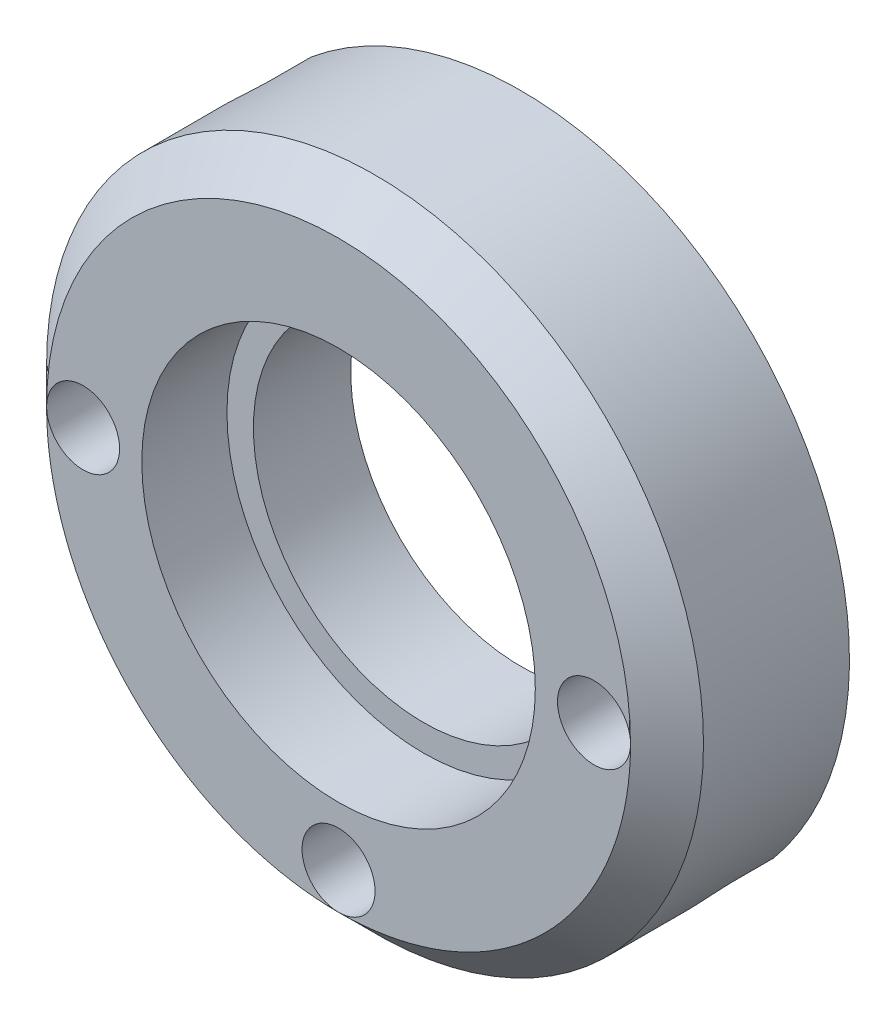
ISO-10303-21;
HEADER;
FILE_DESCRIPTION(('STEP AP214'),'2;1');
FILE_NAME('part.step','',(''),(''),'','','');
FILE_SCHEMA(('AUTOMOTIVE_DESIGN { 1 0 10303 214 1 1 1 1 }'));
ENDSEC;
DATA;
#1=APPLICATION_CONTEXT('core data for automotive mechanical design processes');
#2=APPLICATION_PROTOCOL_DEFINITION('international standard','automotive_design',2000,#1);
#3=PRODUCT_CONTEXT('',#1,'mechanical');
#4=PRODUCT('Part','Part','',(#3));
#5=PRODUCT_RELATED_PRODUCT_CATEGORY('part','',(#4));
#6=PRODUCT_DEFINITION_FORMATION('','',#4);
#7=PRODUCT_DEFINITION_CONTEXT('part definition',#1,'design');
#8=PRODUCT_DEFINITION('design','',#6,#7);
#9=PRODUCT_DEFINITION_SHAPE('','',#8);
#10=(LENGTH_UNIT() NAMED_UNIT(*) SI_UNIT(.MILLI.,.METRE.));
#11=(NAMED_UNIT(*) PLANE_ANGLE_UNIT() SI_UNIT($,.RADIAN.));
#12=(NAMED_UNIT(*) SI_UNIT($,.STERADIAN.) SOLID_ANGLE_UNIT());
#13=UNCERTAINTY_MEASURE_WITH_UNIT(LENGTH_MEASURE(1.E-05),#10,'distance_accuracy_value','');
#14=(GEOMETRIC_REPRESENTATION_CONTEXT(3) GLOBAL_UNCERTAINTY_ASSIGNED_CONTEXT((#13)) GLOBAL_UNIT_ASSIGNED_CONTEXT((#10,
#11,#12)) REPRESENTATION_CONTEXT('',''));
#15=CARTESIAN_POINT('',(0.,0.,0.));
#16=DIRECTION('',(0.,0.,1.));
#17=DIRECTION('',(1.,0.,0.));
#18=AXIS2_PLACEMENT_3D('',#15,#16,#17);
#19=CARTESIAN_POINT('',(0.,0.,0.));
#20=DIRECTION('',(0.,0.,1.));
#21=DIRECTION('',(1.,0.,0.));
#22=AXIS2_PLACEMENT_3D('',#19,#20,#21);
#23=PLANE('',#22);
#24=CARTESIAN_POINT('',(-21.,0.,0.));
#25=DIRECTION('',(0.,0.,1.));
#26=DIRECTION('',(1.,0.,0.));
#27=AXIS2_PLACEMENT_3D('',#24,#25,#26);
#28=CIRCLE('',#27,1.65);
#29=CARTESIAN_POINT('',(-19.35,0.,0.));
#30=VERTEX_POINT('',#29);
#31=EDGE_CURVE('E219',#30,#30,#28,.T.);
#32=ORIENTED_EDGE('',*,*,#31,.T.);
#33=EDGE_LOOP('',(#32));
#34=FACE_BOUND('',#33,.T.);
#35=CARTESIAN_POINT('',(0.,-21.,0.));
#36=DIRECTION('',(0.,0.,1.));
#37=DIRECTION('',(1.,0.,0.));
#38=AXIS2_PLACEMENT_3D('',#35,#36,#37);
#39=CIRCLE('',#38,1.65);
#40=CARTESIAN_POINT('',(1.65,-21.,0.));
#41=VERTEX_POINT('',#40);
#42=EDGE_CURVE('E223',#41,#41,#39,.T.);
#43=ORIENTED_EDGE('',*,*,#42,.T.);
#44=EDGE_LOOP('',(#43));
#45=FACE_BOUND('',#44,.T.);
#46=CARTESIAN_POINT('',(0.,0.,0.));
#47=DIRECTION('',(0.,0.,1.));
#48=DIRECTION('',(1.,0.,0.));
#49=AXIS2_PLACEMENT_3D('',#46,#47,#48);
#50=CIRCLE('',#49,27.);
#51=CARTESIAN_POINT('',(-20.7776328125668,17.2420989066339,0.));
#52=VERTEX_POINT('',#51);
#53=CARTESIAN_POINT('',(17.2420989066341,-20.7776328125667,0.));
#54=VERTEX_POINT('',#53);
#55=EDGE_CURVE('E226',#52,#54,#50,.T.);
#56=ORIENTED_EDGE('',*,*,#55,.F.);
#57=DIRECTION('',(0.707106781186551,-0.707106781186544,0.));
#58=VECTOR('',#57,1.);
#59=CARTESIAN_POINT('',(-28.7677669529665,25.2322330470335,0.));
#60=LINE('',#59,#58);
#61=CARTESIAN_POINT('',(-11.5081468223555,7.97261291642265,0.));
#62=VERTEX_POINT('',#61);
#63=EDGE_CURVE('E134',#52,#62,#60,.T.);
#64=ORIENTED_EDGE('',*,*,#63,.T.);
#65=CARTESIAN_POINT('',(0.,0.,0.));
#66=DIRECTION('',(0.,0.,1.));
#67=DIRECTION('',(1.,0.,0.));
#68=AXIS2_PLACEMENT_3D('',#65,#66,#67);
#69=CIRCLE('',#68,14.);
#70=CARTESIAN_POINT('',(7.97261291642278,-11.5081468223554,0.));
#71=VERTEX_POINT('',#70);
#72=EDGE_CURVE('E273',#62,#71,#69,.T.);
#73=ORIENTED_EDGE('',*,*,#72,.T.);
#74=EDGE_CURVE('E138',#71,#54,#60,.T.);
#75=ORIENTED_EDGE('',*,*,#74,.T.);
#76=EDGE_LOOP('',(#56,#64,#73,#75));
#77=FACE_BOUND('',#76,.T.);
#78=ADVANCED_FACE('F35',(#34,#45,#77),#23,.F.);
#79=CARTESIAN_POINT('',(0.,-21.,0.));
#80=DIRECTION('',(0.,0.,1.));
#81=DIRECTION('',(1.,0.,0.));
#82=AXIS2_PLACEMENT_3D('',#79,#80,#81);
#83=CYLINDRICAL_SURFACE('',#82,1.65);
#84=CARTESIAN_POINT('',(0.,-21.,8.49999999999999));
#85=DIRECTION('',(0.,0.,1.));
#86=DIRECTION('',(1.,0.,0.));
#87=AXIS2_PLACEMENT_3D('',#84,#85,#86);
#88=CIRCLE('',#87,1.65);
#89=CARTESIAN_POINT('',(1.65,-21.,8.49999999999999));
#90=VERTEX_POINT('',#89);
#91=EDGE_CURVE('E230',#90,#90,#88,.T.);
#92=ORIENTED_EDGE('',*,*,#91,.T.);
#93=EDGE_LOOP('',(#92));
#94=FACE_BOUND('',#93,.T.);
#95=ORIENTED_EDGE('',*,*,#42,.F.);
#96=EDGE_LOOP('',(#95));
#97=FACE_BOUND('',#96,.T.);
#98=ADVANCED_FACE('F209',(#94,#97),#83,.F.);
#99=CARTESIAN_POINT('',(21.,0.,0.));
#100=DIRECTION('',(0.,0.,1.));
#101=DIRECTION('',(1.,0.,0.));
#102=AXIS2_PLACEMENT_3D('',#99,#100,#101);
#103=CYLINDRICAL_SURFACE('',#102,1.65);
#104=CARTESIAN_POINT('',(21.,0.,8.49999999999999));
#105=DIRECTION('',(0.,0.,1.));
#106=DIRECTION('',(1.,0.,0.));
#107=AXIS2_PLACEMENT_3D('',#104,#105,#106);
#108=CIRCLE('',#107,1.65);
#109=CARTESIAN_POINT('',(22.65,0.,8.49999999999999));
#110=VERTEX_POINT('',#109);
#111=EDGE_CURVE('E233',#110,#110,#108,.T.);
#112=ORIENTED_EDGE('',*,*,#111,.T.);
#113=EDGE_LOOP('',(#112));
#114=FACE_BOUND('',#113,.T.);
#115=CARTESIAN_POINT('',(21.,0.,0.));
#116=DIRECTION('',(0.,0.,1.));
#117=DIRECTION('',(1.,0.,0.));
#118=AXIS2_PLACEMENT_3D('',#115,#116,#117);
#119=CIRCLE('',#118,1.65);
#120=CARTESIAN_POINT('',(22.65,0.,0.));
#121=VERTEX_POINT('',#120);
#122=EDGE_CURVE('E287',#121,#121,#119,.T.);
#123=ORIENTED_EDGE('',*,*,#122,.F.);
#124=EDGE_LOOP('',(#123));
#125=FACE_BOUND('',#124,.T.);
#126=ADVANCED_FACE('F214',(#114,#125),#103,.F.);
#127=CARTESIAN_POINT('',(-21.,0.,0.));
#128=DIRECTION('',(0.,0.,1.));
#129=DIRECTION('',(1.,0.,0.));
#130=AXIS2_PLACEMENT_3D('',#127,#128,#129);
#131=CYLINDRICAL_SURFACE('',#130,1.65);
#132=CARTESIAN_POINT('',(-21.,0.,8.49999999999999));
#133=DIRECTION('',(0.,0.,1.));
#134=DIRECTION('',(1.,0.,0.));
#135=AXIS2_PLACEMENT_3D('',#132,#133,#134);
#136=CIRCLE('',#135,1.65);
#137=CARTESIAN_POINT('',(-19.35,0.,8.49999999999999));
#138=VERTEX_POINT('',#137);
#139=EDGE_CURVE('E242',#138,#138,#136,.T.);
#140=ORIENTED_EDGE('',*,*,#139,.T.);
#141=EDGE_LOOP('',(#140));
#142=FACE_BOUND('',#141,.T.);
#143=ORIENTED_EDGE('',*,*,#31,.F.);
#144=EDGE_LOOP('',(#143));
#145=FACE_BOUND('',#144,.T.);
#146=ADVANCED_FACE('F188',(#142,#145),#131,.F.);
#147=CARTESIAN_POINT('',(0.,0.,15.));
#148=DIRECTION('',(0.,0.,-1.));
#149=DIRECTION('',(-1.,0.,0.));
#150=AXIS2_PLACEMENT_3D('',#147,#148,#149);
#151=CYLINDRICAL_SURFACE('',#150,27.);
#152=CARTESIAN_POINT('',(0.,0.,12.));
#153=DIRECTION('',(0.,0.,1.));
#154=DIRECTION('',(1.,0.,0.));
#155=AXIS2_PLACEMENT_3D('',#152,#153,#154);
#156=CIRCLE('',#155,27.);
#157=CARTESIAN_POINT('',(27.,0.,12.));
#158=VERTEX_POINT('',#157);
#159=EDGE_CURVE('E261',#158,#158,#156,.F.);
#160=ORIENTED_EDGE('',*,*,#159,.T.);
#161=EDGE_LOOP('',(#160));
#162=FACE_BOUND('',#161,.T.);
#163=ORIENTED_EDGE('',*,*,#55,.T.);
#164=DIRECTION('',(0.,0.,-1.));
#165=VECTOR('',#164,1.);
#166=CARTESIAN_POINT('',(17.2420989066341,-20.7776328125667,15.));
#167=LINE('',#166,#165);
#168=CARTESIAN_POINT('',(17.2420989066341,-20.7776328125667,3.));
#169=VERTEX_POINT('',#168);
#170=EDGE_CURVE('E300',#54,#169,#167,.F.);
#171=ORIENTED_EDGE('',*,*,#170,.T.);
#172=CARTESIAN_POINT('',(17.2420989066341,-20.7776328125667,3.));
#173=CARTESIAN_POINT('',(17.242092113643,-20.7776357941308,3.0701545444243));
#174=CARTESIAN_POINT('',(17.2443810988734,-20.7757388904638,3.14030568935821));
#175=CARTESIAN_POINT('',(17.2534987049175,-20.7681690750989,3.28010312701162));
#176=CARTESIAN_POINT('',(17.2603270361537,-20.7624964042678,3.34974945164855));
#177=CARTESIAN_POINT('',(17.2784634540722,-20.7474054443848,3.48798751070465));
#178=CARTESIAN_POINT('',(17.2897675991885,-20.7379904509313,3.55658011800341));
#179=CARTESIAN_POINT('',(17.3167413230267,-20.7154718920194,3.69226511941136));
#180=CARTESIAN_POINT('',(17.3324108634659,-20.7023683589078,3.7593575266711));
#181=CARTESIAN_POINT('',(17.3857951826166,-20.6575971029751,3.95772640740065));
#182=CARTESIAN_POINT('',(17.4298948560318,-20.6204611606387,4.08616386022387));
#183=CARTESIAN_POINT('',(17.5335007138444,-20.5324363100476,4.33148646651481));
#184=CARTESIAN_POINT('',(17.5930048754751,-20.4815492074222,4.44837313393634));
#185=CARTESIAN_POINT('',(17.7255787132559,-20.3669226517751,4.66774110207968));
#186=CARTESIAN_POINT('',(17.7986845214974,-20.3031489263157,4.77018272547308));
#187=CARTESIAN_POINT('',(17.9559146480707,-20.1642285303134,4.95739831461068));
#188=CARTESIAN_POINT('',(18.0400406409458,-20.0890801310913,5.04216959022038));
#189=CARTESIAN_POINT('',(18.2167228610474,-19.9290045348194,5.19176848261166));
#190=CARTESIAN_POINT('',(18.3092937377399,-19.8440602746613,5.25656055467175));
#191=CARTESIAN_POINT('',(18.4997897738783,-19.6665885563002,5.36412904893103));
#192=CARTESIAN_POINT('',(18.5977144956655,-19.5740617176397,5.40690726772035));
#193=CARTESIAN_POINT('',(18.7956197912796,-19.3841023961368,5.46912123617305));
#194=CARTESIAN_POINT('',(18.8955936592095,-19.2866847525624,5.48862361758948));
#195=CARTESIAN_POINT('',(19.0949101405056,-19.0893705559749,5.50393835168246));
#196=CARTESIAN_POINT('',(19.1942527526262,-18.9894739980719,5.49975065762391));
#197=CARTESIAN_POINT('',(19.3891882675343,-18.7903894106921,5.46785758905663));
#198=CARTESIAN_POINT('',(19.4847917582348,-18.6912001471678,5.4402245477839));
#199=CARTESIAN_POINT('',(19.6700167345719,-18.4961763654849,5.36233786219506));
#200=CARTESIAN_POINT('',(19.7596381813718,-18.4003418691081,5.31208407103638));
#201=CARTESIAN_POINT('',(19.9307723033986,-18.2148368911332,5.19030140427799));
#202=CARTESIAN_POINT('',(20.0122722891732,-18.1251761212316,5.11873991093602));
#203=CARTESIAN_POINT('',(20.1650660247655,-17.9550329416453,4.95640008053041));
#204=CARTESIAN_POINT('',(20.2363599796053,-17.8745503475929,4.86562212958407));
#205=CARTESIAN_POINT('',(20.3673772569364,-17.7251199137954,4.66703368732774));
#206=CARTESIAN_POINT('',(20.4270577343511,-17.6562149097238,4.55916269377615));
#207=CARTESIAN_POINT('',(20.5332453708419,-17.5326124300177,4.32961451167054));
#208=CARTESIAN_POINT('',(20.5797484986951,-17.4779193025134,4.20793311413888));
#209=CARTESIAN_POINT('',(20.6586051909831,-17.3846420633818,3.95415757677761));
#210=CARTESIAN_POINT('',(20.6909479386728,-17.3460702674363,3.82205556749943));
#211=CARTESIAN_POINT('',(20.7407245959599,-17.2865229202207,3.55135630411403));
#212=CARTESIAN_POINT('',(20.7581810870229,-17.2655207179635,3.41276922554558));
#213=CARTESIAN_POINT('',(20.7712383165892,-17.2498019618966,3.2276824918942));
#214=CARTESIAN_POINT('',(20.7736377284412,-17.2469121418256,3.18218674112657));
#215=CARTESIAN_POINT('',(20.7768327899953,-17.2430632091453,3.0911336242028));
#216=CARTESIAN_POINT('',(20.7776311120313,-17.2421008794195,3.0455764879269));
#217=CARTESIAN_POINT('',(20.7776328125668,-17.2420989066339,3.));
#218=B_SPLINE_CURVE_WITH_KNOTS('',3,(#172,#173,#174,#175,#176,#177,#178,#179,#180,#181,#182,
#183,#184,#185,#186,#187,#188,#189,#190,#191,#192,#193,#194,#195,#196,#197,#198,#199,#200,#201,
#202,#203,#204,#205,#206,#207,#208,#209,#210,#211,#212,#213,#214,#215,#216,#217),.UNSPECIFIED.,
.F.,.F.,(4,2,2,2,2,2,2,2,2,2,2,2,2,2,2,2,2,2,2,2,2,2,4),(0.,0.210394586808946,0.420775753245328,
0.630972060898041,0.841166525275143,1.26134710452853,1.68147253774226,2.10273037426022,
2.52405229632554,2.94611951832915,3.36815228920328,3.78897398633507,4.20979651365212,
4.62932542689363,5.04885706354595,5.46903424843744,5.88920299148783,6.31089361871854,
6.73271311088122,7.15485426015842,7.57635390435052,7.71325623090148,7.84992986683264),.UNSPECIFIED.);
#219=CARTESIAN_POINT('',(20.7776328125668,-17.2420989066339,3.));
#220=VERTEX_POINT('',#219);
#221=EDGE_CURVE('E120',#169,#220,#218,.T.);
#222=ORIENTED_EDGE('',*,*,#221,.T.);
#223=DIRECTION('',(0.,0.,-1.));
#224=VECTOR('',#223,1.);
#225=CARTESIAN_POINT('',(20.7776328125668,-17.2420989066339,15.));
#226=LINE('',#225,#224);
#227=CARTESIAN_POINT('',(20.7776328125668,-17.2420989066339,0.));
#228=VERTEX_POINT('',#227);
#229=EDGE_CURVE('E121',#220,#228,#226,.T.);
#230=ORIENTED_EDGE('',*,*,#229,.T.);
#231=CARTESIAN_POINT('',(-17.2420989066341,20.7776328125667,0.));
#232=VERTEX_POINT('',#231);
#233=EDGE_CURVE('E133',#228,#232,#50,.T.);
#234=ORIENTED_EDGE('',*,*,#233,.T.);
#235=DIRECTION('',(0.,0.,-1.));
#236=VECTOR('',#235,1.);
#237=CARTESIAN_POINT('',(-17.2420989066341,20.7776328125667,15.));
#238=LINE('',#237,#236);
#239=CARTESIAN_POINT('',(-17.2420989066341,20.7776328125667,3.));
#240=VERTEX_POINT('',#239);
#241=EDGE_CURVE('E124',#232,#240,#238,.F.);
#242=ORIENTED_EDGE('',*,*,#241,.T.);
#243=CARTESIAN_POINT('',(-17.2420989066341,20.7776328125667,3.));
#244=CARTESIAN_POINT('',(-17.242092113643,20.7776357941308,3.0701545444243));
#245=CARTESIAN_POINT('',(-17.2443810988734,20.7757388904638,3.1403056893582));
#246=CARTESIAN_POINT('',(-17.2534987049175,20.7681690750989,3.28010312701162));
#247=CARTESIAN_POINT('',(-17.2603270361537,20.7624964042678,3.34974945164855));
#248=CARTESIAN_POINT('',(-17.2784634540722,20.7474054443848,3.48798751070464));
#249=CARTESIAN_POINT('',(-17.2897675991885,20.7379904509313,3.55658011800341));
#250=CARTESIAN_POINT('',(-17.3167413230267,20.7154718920194,3.69226511941136));
#251=CARTESIAN_POINT('',(-17.3324108634659,20.7023683589078,3.75935752667109));
#252=CARTESIAN_POINT('',(-17.3857951826166,20.6575971029751,3.95772640740065));
#253=CARTESIAN_POINT('',(-17.4298948560318,20.6204611606387,4.08616386022386));
#254=CARTESIAN_POINT('',(-17.5335007138444,20.5324363100476,4.33148646651481));
#255=CARTESIAN_POINT('',(-17.5930048754751,20.4815492074222,4.44837313393633));
#256=CARTESIAN_POINT('',(-17.7255787132559,20.3669226517751,4.66774110207967));
#257=CARTESIAN_POINT('',(-17.7986845214974,20.3031489263157,4.77018272547307));
#258=CARTESIAN_POINT('',(-17.9559146480707,20.1642285303134,4.95739831461068));
#259=CARTESIAN_POINT('',(-18.0400406409458,20.0890801310913,5.04216959022037));
#260=CARTESIAN_POINT('',(-18.2167228610474,19.9290045348194,5.19176848261166));
#261=CARTESIAN_POINT('',(-18.3092937377399,19.8440602746613,5.25656055467174));
#262=CARTESIAN_POINT('',(-18.4997897738783,19.6665885563002,5.36412904893103));
#263=CARTESIAN_POINT('',(-18.5977144956655,19.5740617176397,5.40690726772035));
#264=CARTESIAN_POINT('',(-18.7956197912796,19.3841023961368,5.46912123617304));
#265=CARTESIAN_POINT('',(-18.8955936592095,19.2866847525624,5.48862361758947));
#266=CARTESIAN_POINT('',(-19.0949101405056,19.0893705559749,5.50393835168245));
#267=CARTESIAN_POINT('',(-19.1942527526262,18.9894739980719,5.4997506576239));
#268=CARTESIAN_POINT('',(-19.3891882675343,18.7903894106921,5.46785758905662));
#269=CARTESIAN_POINT('',(-19.4847917582348,18.6912001471678,5.44022454778389));
#270=CARTESIAN_POINT('',(-19.6700167345719,18.4961763654849,5.36233786219506));
#271=CARTESIAN_POINT('',(-19.7596381813718,18.4003418691081,5.31208407103637));
#272=CARTESIAN_POINT('',(-19.9307723033986,18.2148368911332,5.19030140427799));
#273=CARTESIAN_POINT('',(-20.0122722891732,18.1251761212316,5.11873991093601));
#274=CARTESIAN_POINT('',(-20.1650660247655,17.9550329416453,4.9564000805304));
#275=CARTESIAN_POINT('',(-20.2363599796053,17.8745503475929,4.86562212958407));
#276=CARTESIAN_POINT('',(-20.3673772569364,17.7251199137954,4.66703368732774));
#277=CARTESIAN_POINT('',(-20.4270577343511,17.6562149097238,4.55916269377615));
#278=CARTESIAN_POINT('',(-20.5332453708419,17.5326124300178,4.32961451167053));
#279=CARTESIAN_POINT('',(-20.5797484986951,17.4779193025134,4.20793311413887));
#280=CARTESIAN_POINT('',(-20.6586051909831,17.3846420633818,3.9541575767776));
#281=CARTESIAN_POINT('',(-20.6909479386728,17.3460702674363,3.82205556749942));
#282=CARTESIAN_POINT('',(-20.7407245959599,17.2865229202207,3.55135630411402));
#283=CARTESIAN_POINT('',(-20.7581810870229,17.2655207179635,3.41276922554557));
#284=CARTESIAN_POINT('',(-20.7712383165892,17.2498019618966,3.2276824918942));
#285=CARTESIAN_POINT('',(-20.7736377284412,17.2469121418256,3.18218674112657));
#286=CARTESIAN_POINT('',(-20.7768327899953,17.2430632091452,3.0911336242028));
#287=CARTESIAN_POINT('',(-20.7776311120313,17.2421008794195,3.0455764879269));
#288=CARTESIAN_POINT('',(-20.7776328125668,17.2420989066339,3.));
#289=B_SPLINE_CURVE_WITH_KNOTS('',3,(#243,#244,#245,#246,#247,#248,#249,#250,#251,#252,#253,
#254,#255,#256,#257,#258,#259,#260,#261,#262,#263,#264,#265,#266,#267,#268,#269,#270,#271,#272,
#273,#274,#275,#276,#277,#278,#279,#280,#281,#282,#283,#284,#285,#286,#287,#288),.UNSPECIFIED.,
.F.,.F.,(4,2,2,2,2,2,2,2,2,2,2,2,2,2,2,2,2,2,2,2,2,2,4),(0.,0.210394586808946,0.420775753245328,
0.630972060898041,0.841166525275141,1.26134710452853,1.68147253774225,2.10273037426022,
2.52405229632554,2.94611951832915,3.36815228920328,3.78897398633507,4.20979651365212,
4.62932542689363,5.04885706354595,5.46903424843744,5.88920299148782,6.31089361871853,
6.73271311088122,7.15485426015842,7.57635390435052,7.71325623090148,7.84992986683264),.UNSPECIFIED.);
#290=CARTESIAN_POINT('',(-20.7776328125668,17.2420989066339,3.));
#291=VERTEX_POINT('',#290);
#292=EDGE_CURVE('E110',#240,#291,#289,.T.);
#293=ORIENTED_EDGE('',*,*,#292,.T.);
#294=DIRECTION('',(0.,0.,-1.));
#295=VECTOR('',#294,1.);
#296=CARTESIAN_POINT('',(-20.7776328125668,17.2420989066339,15.));
#297=LINE('',#296,#295);
#298=EDGE_CURVE('E297',#291,#52,#297,.T.);
#299=ORIENTED_EDGE('',*,*,#298,.T.);
#300=EDGE_LOOP('',(#163,#171,#222,#230,#234,#242,#293,#299));
#301=FACE_BOUND('',#300,.T.);
#302=ADVANCED_FACE('F130',(#162,#301),#151,.T.);
#303=CARTESIAN_POINT('',(0.,0.,15.));
#304=DIRECTION('',(0.,0.,1.));
#305=DIRECTION('',(1.,0.,0.));
#306=AXIS2_PLACEMENT_3D('',#303,#304,#305);
#307=PLANE('',#306);
#308=CARTESIAN_POINT('',(21.,0.,15.));
#309=DIRECTION('',(0.,0.,1.));
#310=DIRECTION('',(1.,0.,0.));
#311=AXIS2_PLACEMENT_3D('',#308,#309,#310);
#312=CIRCLE('',#311,3.);
#313=CARTESIAN_POINT('',(24.,0.,15.));
#314=VERTEX_POINT('',#313);
#315=EDGE_CURVE('E293',#314,#314,#312,.T.);
#316=ORIENTED_EDGE('',*,*,#315,.F.);
#317=CARTESIAN_POINT('',(0.,0.,15.));
#318=DIRECTION('',(0.,0.,1.));
#319=DIRECTION('',(1.,0.,0.));
#320=AXIS2_PLACEMENT_3D('',#317,#318,#319);
#321=CIRCLE('',#320,24.);
#322=CARTESIAN_POINT('',(-24.,0.,15.));
#323=VERTEX_POINT('',#322);
#324=EDGE_CURVE('E258',#314,#323,#321,.T.);
#325=ORIENTED_EDGE('',*,*,#324,.T.);
#326=CARTESIAN_POINT('',(-21.,0.,15.));
#327=DIRECTION('',(0.,0.,1.));
#328=DIRECTION('',(1.,0.,0.));
#329=AXIS2_PLACEMENT_3D('',#326,#327,#328);
#330=CIRCLE('',#329,3.);
#331=EDGE_CURVE('E289',#323,#323,#330,.T.);
#332=ORIENTED_EDGE('',*,*,#331,.F.);
#333=CARTESIAN_POINT('',(0.,0.,15.));
#334=DIRECTION('',(0.,0.,1.));
#335=DIRECTION('',(1.,0.,0.));
#336=AXIS2_PLACEMENT_3D('',#333,#334,#335);
#337=CIRCLE('',#336,24.);
#338=CARTESIAN_POINT('',(0.,-24.,15.));
#339=VERTEX_POINT('',#338);
#340=EDGE_CURVE('E256',#323,#339,#337,.T.);
#341=ORIENTED_EDGE('',*,*,#340,.T.);
#342=CARTESIAN_POINT('',(0.,-21.,15.));
#343=DIRECTION('',(0.,0.,1.));
#344=DIRECTION('',(1.,0.,0.));
#345=AXIS2_PLACEMENT_3D('',#342,#343,#344);
#346=CIRCLE('',#345,3.);
#347=EDGE_CURVE('E294',#339,#339,#346,.T.);
#348=ORIENTED_EDGE('',*,*,#347,.F.);
#349=CARTESIAN_POINT('',(0.,0.,15.));
#350=DIRECTION('',(0.,0.,1.));
#351=DIRECTION('',(1.,0.,0.));
#352=AXIS2_PLACEMENT_3D('',#349,#350,#351);
#353=CIRCLE('',#352,24.);
#354=EDGE_CURVE('E254',#339,#314,#353,.T.);
#355=ORIENTED_EDGE('',*,*,#354,.T.);
#356=EDGE_LOOP('',(#316,#325,#332,#341,#348,#355));
#357=FACE_BOUND('',#356,.T.);
#358=CARTESIAN_POINT('',(0.,0.,15.));
#359=DIRECTION('',(0.,0.,1.));
#360=DIRECTION('',(1.,0.,0.));
#361=AXIS2_PLACEMENT_3D('',#358,#359,#360);
#362=CIRCLE('',#361,16.175);
#363=CARTESIAN_POINT('',(16.175,0.,15.));
#364=VERTEX_POINT('',#363);
#365=EDGE_CURVE('E237',#364,#364,#362,.T.);
#366=ORIENTED_EDGE('',*,*,#365,.F.);
#367=EDGE_LOOP('',(#366));
#368=FACE_BOUND('',#367,.T.);
#369=ADVANCED_FACE('F199',(#357,#368),#307,.T.);
#370=ORIENTED_EDGE('',*,*,#122,.T.);
#371=EDGE_LOOP('',(#370));
#372=FACE_BOUND('',#371,.T.);
#373=ORIENTED_EDGE('',*,*,#233,.F.);
#374=DIRECTION('',(0.707106781186551,-0.707106781186544,0.));
#375=VECTOR('',#374,1.);
#376=CARTESIAN_POINT('',(-25.2322330470338,28.7677669529662,0.));
#377=LINE('',#376,#375);
#378=CARTESIAN_POINT('',(11.5081468223555,-7.97261291642266,0.));
#379=VERTEX_POINT('',#378);
#380=EDGE_CURVE('E141',#379,#228,#377,.T.);
#381=ORIENTED_EDGE('',*,*,#380,.F.);
#382=CARTESIAN_POINT('',(-7.97261291642277,11.5081468223554,0.));
#383=VERTEX_POINT('',#382);
#384=EDGE_CURVE('E271',#379,#383,#69,.T.);
#385=ORIENTED_EDGE('',*,*,#384,.T.);
#386=EDGE_CURVE('E58',#232,#383,#377,.T.);
#387=ORIENTED_EDGE('',*,*,#386,.F.);
#388=EDGE_LOOP('',(#373,#381,#385,#387));
#389=FACE_BOUND('',#388,.T.);
#390=ADVANCED_FACE('F197',(#372,#389),#23,.F.);
#391=CARTESIAN_POINT('',(0.,0.,8.));
#392=DIRECTION('',(0.,0.,1.));
#393=DIRECTION('',(1.,0.,0.));
#394=AXIS2_PLACEMENT_3D('',#391,#392,#393);
#395=CYLINDRICAL_SURFACE('',#394,16.175);
#396=CARTESIAN_POINT('',(0.,0.,8.));
#397=DIRECTION('',(0.,0.,1.));
#398=DIRECTION('',(1.,0.,0.));
#399=AXIS2_PLACEMENT_3D('',#396,#397,#398);
#400=CIRCLE('',#399,16.175);
#401=CARTESIAN_POINT('',(16.175,0.,8.));
#402=VERTEX_POINT('',#401);
#403=EDGE_CURVE('E235',#402,#402,#400,.T.);
#404=ORIENTED_EDGE('',*,*,#403,.F.);
#405=EDGE_LOOP('',(#404));
#406=FACE_BOUND('',#405,.T.);
#407=ORIENTED_EDGE('',*,*,#365,.T.);
#408=EDGE_LOOP('',(#407));
#409=FACE_BOUND('',#408,.T.);
#410=ADVANCED_FACE('F193',(#406,#409),#395,.F.);
#411=CARTESIAN_POINT('',(0.,0.,8.));
#412=DIRECTION('',(0.,0.,1.));
#413=DIRECTION('',(1.,0.,0.));
#414=AXIS2_PLACEMENT_3D('',#411,#412,#413);
#415=PLANE('',#414);
#416=CARTESIAN_POINT('',(0.,0.,8.));
#417=DIRECTION('',(0.,0.,1.));
#418=DIRECTION('',(1.,0.,0.));
#419=AXIS2_PLACEMENT_3D('',#416,#417,#418);
#420=CIRCLE('',#419,14.);
#421=CARTESIAN_POINT('',(14.,0.,8.));
#422=VERTEX_POINT('',#421);
#423=EDGE_CURVE('E274',#422,#422,#420,.T.);
#424=ORIENTED_EDGE('',*,*,#423,.F.);
#425=EDGE_LOOP('',(#424));
#426=FACE_BOUND('',#425,.T.);
#427=ORIENTED_EDGE('',*,*,#403,.T.);
#428=EDGE_LOOP('',(#427));
#429=FACE_BOUND('',#428,.T.);
#430=ADVANCED_FACE('F186',(#426,#429),#415,.T.);
#431=CARTESIAN_POINT('',(0.,0.,0.));
#432=DIRECTION('',(0.,0.,1.));
#433=DIRECTION('',(1.,0.,0.));
#434=AXIS2_PLACEMENT_3D('',#431,#432,#433);
#435=CYLINDRICAL_SURFACE('',#434,14.);
#436=ORIENTED_EDGE('',*,*,#72,.F.);
#437=DIRECTION('',(0.,0.,1.));
#438=VECTOR('',#437,1.);
#439=CARTESIAN_POINT('',(-11.5081468223555,7.97261291642266,0.));
#440=LINE('',#439,#438);
#441=CARTESIAN_POINT('',(-11.5081468223555,7.97261291642265,3.));
#442=VERTEX_POINT('',#441);
#443=EDGE_CURVE('E11',#62,#442,#440,.T.);
#444=ORIENTED_EDGE('',*,*,#443,.T.);
#445=CARTESIAN_POINT('',(-11.5081468223555,7.97261291642266,3.));
#446=CARTESIAN_POINT('',(-11.5081482751869,7.97260392155317,3.06971697638907));
#447=CARTESIAN_POINT('',(-11.5064589260711,7.97504915039907,3.13942998362751));
#448=CARTESIAN_POINT('',(-11.499711218503,7.98477964839801,3.27834605861581));
#449=CARTESIAN_POINT('',(-11.494653223865,7.99206439488195,3.34754918061746));
#450=CARTESIAN_POINT('',(-11.4811899418938,8.01139244550216,3.48486566373059));
#451=CARTESIAN_POINT('',(-11.4727891991963,8.02342928874825,3.55298037434703));
#452=CARTESIAN_POINT('',(-11.452673263559,8.05211645225039,3.68771316255523));
#453=CARTESIAN_POINT('',(-11.4409580683183,8.0687667757091,3.75433123910799));
#454=CARTESIAN_POINT('',(-11.4008770170918,8.12540307029336,3.9512638683339));
#455=CARTESIAN_POINT('',(-11.3675661198317,8.17208844144952,4.0787551465722));
#456=CARTESIAN_POINT('',(-11.2882171430319,8.28134538688756,4.32237599287896));
#457=CARTESIAN_POINT('',(-11.2421785086967,8.34391765366125,4.43850506537596));
#458=CARTESIAN_POINT('',(-11.1374273498375,8.48324021657734,4.65748626733189));
#459=CARTESIAN_POINT('',(-11.078592635109,8.56012609646048,4.7601939412292));
#460=CARTESIAN_POINT('',(-10.9493752177633,8.72479890385242,4.94814426496264));
#461=CARTESIAN_POINT('',(-10.8789907424044,8.81258750428666,5.03338422920341));
#462=CARTESIAN_POINT('',(-10.7273390429224,8.99658186345854,5.18452843563948));
#463=CARTESIAN_POINT('',(-10.6460003950004,9.09284129108374,5.25029585715184));
#464=CARTESIAN_POINT('',(-10.4744715191747,9.28991329397723,5.35974231123105));
#465=CARTESIAN_POINT('',(-10.3842824488026,9.39072527289652,5.40342422773836));
#466=CARTESIAN_POINT('',(-10.1981825022824,9.59248148539148,5.46701608599129));
#467=CARTESIAN_POINT('',(-10.102342021046,9.69341310554671,5.48717193496554));
#468=CARTESIAN_POINT('',(-9.90665109994172,9.89332205591302,5.50390501376051));
#469=CARTESIAN_POINT('',(-9.80680087694968,9.99229949138975,5.50048351711136));
#470=CARTESIAN_POINT('',(-9.60718017574208,10.1843538968597,5.47034819624431));
#471=CARTESIAN_POINT('',(-9.50742170472061,10.2774851689182,5.4438997074663));
#472=CARTESIAN_POINT('',(-9.30993391670704,10.4567167067106,5.36888017727771));
#473=CARTESIAN_POINT('',(-9.21220465495475,10.5428167812254,5.32030853444662));
#474=CARTESIAN_POINT('',(-9.02142927449996,10.7065266045712,5.20216299897989));
#475=CARTESIAN_POINT('',(-8.92841014194874,10.7840898900408,5.13248123964125));
#476=CARTESIAN_POINT('',(-8.75073647420142,10.9287582634635,4.97417505886994));
#477=CARTESIAN_POINT('',(-8.66608241673855,10.9958627542363,4.88554955646475));
#478=CARTESIAN_POINT('',(-8.50701852855722,11.1193945666923,4.69041868144176));
#479=CARTESIAN_POINT('',(-8.43276617568633,11.1756617780058,4.58368346163122));
#480=CARTESIAN_POINT('',(-8.29871657293149,11.275562799883,4.35609147898948));
#481=CARTESIAN_POINT('',(-8.2389233986081,11.3191930491921,4.23523074885368));
#482=CARTESIAN_POINT('',(-8.13613264951051,11.3933043807004,3.98252002485493));
#483=CARTESIAN_POINT('',(-8.09316876378484,11.4237591005803,3.85064862307629));
#484=CARTESIAN_POINT('',(-8.02611121959555,11.4709741961224,3.57995137588755));
#485=CARTESIAN_POINT('',(-8.00198939541684,11.4877550135984,3.44113624200724));
#486=CARTESIAN_POINT('',(-7.98273815022568,11.5011265272899,3.25103901048054));
#487=CARTESIAN_POINT('',(-7.97894047773278,11.503760966035,3.20089831384011));
#488=CARTESIAN_POINT('',(-7.97388099504829,11.5072687175228,3.10051246529162));
#489=CARTESIAN_POINT('',(-7.97261492305557,11.5081449900437,3.05026763171408));
#490=CARTESIAN_POINT('',(-7.97261291642277,11.5081468223554,3.));
#491=B_SPLINE_CURVE_WITH_KNOTS('',3,(#445,#446,#447,#448,#449,#450,#451,#452,#453,#454,#455,
#456,#457,#458,#459,#460,#461,#462,#463,#464,#465,#466,#467,#468,#469,#470,#471,#472,#473,#474,
#475,#476,#477,#478,#479,#480,#481,#482,#483,#484,#485,#486,#487,#488,#489,#490),.UNSPECIFIED.,
.F.,.F.,(4,2,2,2,2,2,2,2,2,2,2,2,2,2,2,2,2,2,2,2,2,2,4),(0.,0.209080632365448,0.41813868764087,
0.626913483707537,0.835688424705488,1.25294270731087,1.67021518068189,2.09166233739033,
2.51317424149734,2.93758113507458,3.36193259498486,3.78180761495385,4.2016599555548,
4.61673750871168,5.03182634647342,5.44907300587891,5.8663434806745,6.28937182366545,
6.71251926562592,7.13650949186788,7.55986470459477,7.71085292872879,7.86158675831533),.UNSPECIFIED.);
#492=CARTESIAN_POINT('',(-7.97261291642277,11.5081468223554,3.));
#493=VERTEX_POINT('',#492);
#494=EDGE_CURVE('E43',#442,#493,#491,.T.);
#495=ORIENTED_EDGE('',*,*,#494,.T.);
#496=DIRECTION('',(0.,0.,1.));
#497=VECTOR('',#496,1.);
#498=CARTESIAN_POINT('',(-7.97261291642277,11.5081468223554,0.));
#499=LINE('',#498,#497);
#500=EDGE_CURVE('E125',#493,#383,#499,.F.);
#501=ORIENTED_EDGE('',*,*,#500,.T.);
#502=ORIENTED_EDGE('',*,*,#384,.F.);
#503=DIRECTION('',(0.,0.,1.));
#504=VECTOR('',#503,1.);
#505=CARTESIAN_POINT('',(11.5081468223555,-7.97261291642265,0.));
#506=LINE('',#505,#504);
#507=CARTESIAN_POINT('',(11.5081468223555,-7.97261291642265,3.));
#508=VERTEX_POINT('',#507);
#509=EDGE_CURVE('E263',#379,#508,#506,.T.);
#510=ORIENTED_EDGE('',*,*,#509,.T.);
#511=CARTESIAN_POINT('',(11.5081468223555,-7.97261291642265,3.));
#512=CARTESIAN_POINT('',(11.5081482751869,-7.97260392155316,3.06971697638908));
#513=CARTESIAN_POINT('',(11.5064589260711,-7.97504915039906,3.13942998362751));
#514=CARTESIAN_POINT('',(11.499711218503,-7.98477964839801,3.27834605861581));
#515=CARTESIAN_POINT('',(11.494653223865,-7.99206439488194,3.34754918061746));
#516=CARTESIAN_POINT('',(11.4811899418938,-8.01139244550216,3.48486566373059));
#517=CARTESIAN_POINT('',(11.4727891991963,-8.02342928874826,3.55298037434703));
#518=CARTESIAN_POINT('',(11.452673263559,-8.0521164522504,3.68771316255523));
#519=CARTESIAN_POINT('',(11.4409580683183,-8.06876677570911,3.754331239108));
#520=CARTESIAN_POINT('',(11.4008770170918,-8.12540307029336,3.9512638683339));
#521=CARTESIAN_POINT('',(11.3675661198317,-8.17208844144952,4.07875514657221));
#522=CARTESIAN_POINT('',(11.2882171430319,-8.28134538688756,4.32237599287897));
#523=CARTESIAN_POINT('',(11.2421785086967,-8.34391765366125,4.43850506537597));
#524=CARTESIAN_POINT('',(11.1374273498375,-8.48324021657734,4.65748626733189));
#525=CARTESIAN_POINT('',(11.078592635109,-8.56012609646048,4.76019394122921));
#526=CARTESIAN_POINT('',(10.9493752177633,-8.72479890385242,4.94814426496264));
#527=CARTESIAN_POINT('',(10.8789907424044,-8.81258750428667,5.03338422920341));
#528=CARTESIAN_POINT('',(10.7273390429224,-8.99658186345854,5.18452843563949));
#529=CARTESIAN_POINT('',(10.6460003950004,-9.09284129108374,5.25029585715184));
#530=CARTESIAN_POINT('',(10.4744715191746,-9.28991329397723,5.35974231123105));
#531=CARTESIAN_POINT('',(10.3842824488026,-9.39072527289652,5.40342422773836));
#532=CARTESIAN_POINT('',(10.1981825022824,-9.59248148539148,5.46701608599129));
#533=CARTESIAN_POINT('',(10.102342021046,-9.69341310554671,5.48717193496554));
#534=CARTESIAN_POINT('',(9.90665109994172,-9.89332205591302,5.50390501376051));
#535=CARTESIAN_POINT('',(9.80680087694968,-9.99229949138975,5.50048351711136));
#536=CARTESIAN_POINT('',(9.60718017574208,-10.1843538968597,5.47034819624431));
#537=CARTESIAN_POINT('',(9.50742170472061,-10.2774851689182,5.4438997074663));
#538=CARTESIAN_POINT('',(9.30993391670704,-10.4567167067105,5.36888017727771));
#539=CARTESIAN_POINT('',(9.21220465495475,-10.5428167812254,5.32030853444663));
#540=CARTESIAN_POINT('',(9.02142927449996,-10.7065266045712,5.20216299897989));
#541=CARTESIAN_POINT('',(8.92841014194874,-10.7840898900408,5.13248123964126));
#542=CARTESIAN_POINT('',(8.75073647420142,-10.9287582634635,4.97417505886994));
#543=CARTESIAN_POINT('',(8.66608241673855,-10.9958627542363,4.88554955646475));
#544=CARTESIAN_POINT('',(8.50701852855722,-11.1193945666923,4.69041868144176));
#545=CARTESIAN_POINT('',(8.43276617568633,-11.1756617780058,4.58368346163122));
#546=CARTESIAN_POINT('',(8.29871657293149,-11.275562799883,4.35609147898948));
#547=CARTESIAN_POINT('',(8.23892339860811,-11.3191930491921,4.23523074885369));
#548=CARTESIAN_POINT('',(8.13613264951051,-11.3933043807004,3.98252002485493));
#549=CARTESIAN_POINT('',(8.09316876378484,-11.4237591005803,3.8506486230763));
#550=CARTESIAN_POINT('',(8.02611121959555,-11.4709741961224,3.57995137588756));
#551=CARTESIAN_POINT('',(8.00198939541685,-11.4877550135984,3.44113624200724));
#552=CARTESIAN_POINT('',(7.98273815022568,-11.5011265272899,3.25103901048055));
#553=CARTESIAN_POINT('',(7.97894047773278,-11.503760966035,3.20089831384012));
#554=CARTESIAN_POINT('',(7.97388099504829,-11.5072687175228,3.10051246529162));
#555=CARTESIAN_POINT('',(7.97261492305557,-11.5081449900437,3.05026763171408));
#556=CARTESIAN_POINT('',(7.97261291642277,-11.5081468223554,3.));
#557=B_SPLINE_CURVE_WITH_KNOTS('',3,(#511,#512,#513,#514,#515,#516,#517,#518,#519,#520,#521,
#522,#523,#524,#525,#526,#527,#528,#529,#530,#531,#532,#533,#534,#535,#536,#537,#538,#539,#540,
#541,#542,#543,#544,#545,#546,#547,#548,#549,#550,#551,#552,#553,#554,#555,#556),.UNSPECIFIED.,
.F.,.F.,(4,2,2,2,2,2,2,2,2,2,2,2,2,2,2,2,2,2,2,2,2,2,4),(0.,0.209080632365448,0.41813868764087,
0.626913483707538,0.835688424705489,1.25294270731087,1.67021518068189,2.09166233739033,
2.51317424149734,2.93758113507458,3.36193259498486,3.78180761495385,4.2016599555548,
4.61673750871167,5.03182634647341,5.44907300587891,5.8663434806745,6.28937182366545,
6.71251926562591,7.13650949186788,7.55986470459476,7.71085292872879,7.86158675831533),.UNSPECIFIED.);
#558=CARTESIAN_POINT('',(7.97261291642276,-11.5081468223554,3.));
#559=VERTEX_POINT('',#558);
#560=EDGE_CURVE('E168',#508,#559,#557,.T.);
#561=ORIENTED_EDGE('',*,*,#560,.T.);
#562=DIRECTION('',(0.,0.,1.));
#563=VECTOR('',#562,1.);
#564=CARTESIAN_POINT('',(7.97261291642277,-11.5081468223554,0.));
#565=LINE('',#564,#563);
#566=EDGE_CURVE('E267',#559,#71,#565,.F.);
#567=ORIENTED_EDGE('',*,*,#566,.T.);
#568=EDGE_LOOP('',(#436,#444,#495,#501,#502,#510,#561,#567));
#569=FACE_BOUND('',#568,.T.);
#570=ORIENTED_EDGE('',*,*,#423,.T.);
#571=EDGE_LOOP('',(#570));
#572=FACE_BOUND('',#571,.T.);
#573=ADVANCED_FACE('F180',(#569,#572),#435,.F.);
#574=CARTESIAN_POINT('',(-21.,0.,10.));
#575=DIRECTION('',(0.,0.,1.));
#576=DIRECTION('',(1.,0.,0.));
#577=AXIS2_PLACEMENT_3D('',#574,#575,#576);
#578=CYLINDRICAL_SURFACE('',#577,3.);
#579=CARTESIAN_POINT('',(-21.,0.,9.84999999999997));
#580=DIRECTION('',(0.,0.,1.));
#581=DIRECTION('',(1.,0.,0.));
#582=AXIS2_PLACEMENT_3D('',#579,#580,#581);
#583=CIRCLE('',#582,3.);
#584=CARTESIAN_POINT('',(-18.,0.,9.84999999999997));
#585=VERTEX_POINT('',#584);
#586=EDGE_CURVE('E251',#585,#585,#583,.F.);
#587=ORIENTED_EDGE('',*,*,#586,.T.);
#588=EDGE_LOOP('',(#587));
#589=FACE_BOUND('',#588,.T.);
#590=ORIENTED_EDGE('',*,*,#331,.T.);
#591=EDGE_LOOP('',(#590));
#592=FACE_BOUND('',#591,.T.);
#593=ADVANCED_FACE('F185',(#589,#592),#578,.F.);
#594=CARTESIAN_POINT('',(21.,0.,10.));
#595=DIRECTION('',(0.,0.,1.));
#596=DIRECTION('',(1.,0.,0.));
#597=AXIS2_PLACEMENT_3D('',#594,#595,#596);
#598=CYLINDRICAL_SURFACE('',#597,3.);
#599=CARTESIAN_POINT('',(21.,0.,9.84999999999998));
#600=DIRECTION('',(0.,0.,1.));
#601=DIRECTION('',(1.,0.,0.));
#602=AXIS2_PLACEMENT_3D('',#599,#600,#601);
#603=CIRCLE('',#602,3.);
#604=CARTESIAN_POINT('',(24.,0.,9.84999999999998));
#605=VERTEX_POINT('',#604);
#606=EDGE_CURVE('E248',#605,#605,#603,.F.);
#607=ORIENTED_EDGE('',*,*,#606,.T.);
#608=EDGE_LOOP('',(#607));
#609=FACE_BOUND('',#608,.T.);
#610=ORIENTED_EDGE('',*,*,#315,.T.);
#611=EDGE_LOOP('',(#610));
#612=FACE_BOUND('',#611,.T.);
#613=ADVANCED_FACE('F380',(#609,#612),#598,.F.);
#614=CARTESIAN_POINT('',(0.,-21.,10.));
#615=DIRECTION('',(0.,0.,1.));
#616=DIRECTION('',(1.,0.,0.));
#617=AXIS2_PLACEMENT_3D('',#614,#615,#616);
#618=CYLINDRICAL_SURFACE('',#617,3.);
#619=CARTESIAN_POINT('',(0.,-21.,9.84999999999997));
#620=DIRECTION('',(0.,0.,1.));
#621=DIRECTION('',(1.,0.,0.));
#622=AXIS2_PLACEMENT_3D('',#619,#620,#621);
#623=CIRCLE('',#622,3.);
#624=CARTESIAN_POINT('',(3.,-21.,9.84999999999997));
#625=VERTEX_POINT('',#624);
#626=EDGE_CURVE('E245',#625,#625,#623,.F.);
#627=ORIENTED_EDGE('',*,*,#626,.T.);
#628=EDGE_LOOP('',(#627));
#629=FACE_BOUND('',#628,.T.);
#630=ORIENTED_EDGE('',*,*,#347,.T.);
#631=EDGE_LOOP('',(#630));
#632=FACE_BOUND('',#631,.T.);
#633=ADVANCED_FACE('F374',(#629,#632),#618,.F.);
#634=CARTESIAN_POINT('',(0.,-21.,10.));
#635=DIRECTION('',(0.,0.,1.));
#636=DIRECTION('',(1.,0.,0.));
#637=AXIS2_PLACEMENT_3D('',#634,#635,#636);
#638=CONICAL_SURFACE('',#637,3.15000000000003,0.785398163397454);
#639=ORIENTED_EDGE('',*,*,#91,.F.);
#640=EDGE_LOOP('',(#639));
#641=FACE_BOUND('',#640,.T.);
#642=ORIENTED_EDGE('',*,*,#626,.F.);
#643=EDGE_LOOP('',(#642));
#644=FACE_BOUND('',#643,.T.);
#645=ADVANCED_FACE('F379',(#641,#644),#638,.F.);
#646=CARTESIAN_POINT('',(21.,0.,10.));
#647=DIRECTION('',(0.,0.,1.));
#648=DIRECTION('',(1.,0.,0.));
#649=AXIS2_PLACEMENT_3D('',#646,#647,#648);
#650=CONICAL_SURFACE('',#649,3.15000000000002,0.785398163397453);
#651=ORIENTED_EDGE('',*,*,#111,.F.);
#652=EDGE_LOOP('',(#651));
#653=FACE_BOUND('',#652,.T.);
#654=ORIENTED_EDGE('',*,*,#606,.F.);
#655=EDGE_LOOP('',(#654));
#656=FACE_BOUND('',#655,.T.);
#657=ADVANCED_FACE('F412',(#653,#656),#650,.F.);
#658=CARTESIAN_POINT('',(-21.,0.,10.));
#659=DIRECTION('',(0.,0.,1.));
#660=DIRECTION('',(1.,0.,0.));
#661=AXIS2_PLACEMENT_3D('',#658,#659,#660);
#662=CONICAL_SURFACE('',#661,3.15000000000002,0.785398163397453);
#663=ORIENTED_EDGE('',*,*,#139,.F.);
#664=EDGE_LOOP('',(#663));
#665=FACE_BOUND('',#664,.T.);
#666=ORIENTED_EDGE('',*,*,#586,.F.);
#667=EDGE_LOOP('',(#666));
#668=FACE_BOUND('',#667,.T.);
#669=ADVANCED_FACE('F310',(#665,#668),#662,.F.);
#670=CARTESIAN_POINT('',(0.,0.,15.));
#671=DIRECTION('',(0.,0.,-1.));
#672=DIRECTION('',(-1.,0.,0.));
#673=AXIS2_PLACEMENT_3D('',#670,#671,#672);
#674=CONICAL_SURFACE('',#673,24.,0.785398163397448);
#675=ORIENTED_EDGE('',*,*,#159,.F.);
#676=EDGE_LOOP('',(#675));
#677=FACE_BOUND('',#676,.T.);
#678=ORIENTED_EDGE('',*,*,#340,.F.);
#679=ORIENTED_EDGE('',*,*,#324,.F.);
#680=ORIENTED_EDGE('',*,*,#354,.F.);
#681=EDGE_LOOP('',(#678,#679,#680));
#682=FACE_BOUND('',#681,.T.);
#683=ADVANCED_FACE('F37',(#677,#682),#674,.T.);
#684=CARTESIAN_POINT('',(-25.2322330470338,28.7677669529662,0.));
#685=DIRECTION('',(0.707106781186544,0.707106781186551,0.));
#686=DIRECTION('',(-0.707106781186551,0.707106781186544,0.));
#687=AXIS2_PLACEMENT_3D('',#684,#685,#686);
#688=PLANE('',#687);
#689=DIRECTION('',(0.707106781186551,-0.707106781186544,0.));
#690=VECTOR('',#689,1.);
#691=CARTESIAN_POINT('',(-25.2322330470338,28.7677669529662,3.));
#692=LINE('',#691,#690);
#693=EDGE_CURVE('E50',#508,#220,#692,.T.);
#694=ORIENTED_EDGE('',*,*,#693,.F.);
#695=ORIENTED_EDGE('',*,*,#509,.F.);
#696=ORIENTED_EDGE('',*,*,#380,.T.);
#697=ORIENTED_EDGE('',*,*,#229,.F.);
#698=EDGE_LOOP('',(#694,#695,#696,#697));
#699=FACE_BOUND('',#698,.T.);
#700=ADVANCED_FACE('F161',(#699),#688,.F.);
#701=CARTESIAN_POINT('',(-27.0000000000001,26.9999999999999,3.));
#702=DIRECTION('',(0.707106781186551,-0.707106781186544,0.));
#703=DIRECTION('',(0.707106781186544,0.707106781186551,0.));
#704=AXIS2_PLACEMENT_3D('',#701,#702,#703);
#705=CYLINDRICAL_SURFACE('',#704,2.5);
#706=DIRECTION('',(0.707106781186551,-0.707106781186544,0.));
#707=VECTOR('',#706,1.);
#708=CARTESIAN_POINT('',(-28.7677669529665,25.2322330470335,3.));
#709=LINE('',#708,#707);
#710=EDGE_CURVE('E126',#559,#169,#709,.T.);
#711=ORIENTED_EDGE('',*,*,#710,.F.);
#712=ORIENTED_EDGE('',*,*,#560,.F.);
#713=ORIENTED_EDGE('',*,*,#693,.T.);
#714=ORIENTED_EDGE('',*,*,#221,.F.);
#715=EDGE_LOOP('',(#711,#712,#713,#714));
#716=FACE_BOUND('',#715,.T.);
#717=ADVANCED_FACE('F155',(#716),#705,.F.);
#718=CARTESIAN_POINT('',(-28.7677669529665,25.2322330470335,0.));
#719=DIRECTION('',(-0.707106781186544,-0.707106781186551,0.));
#720=DIRECTION('',(0.707106781186551,-0.707106781186544,0.));
#721=AXIS2_PLACEMENT_3D('',#718,#719,#720);
#722=PLANE('',#721);
#723=ORIENTED_EDGE('',*,*,#74,.F.);
#724=ORIENTED_EDGE('',*,*,#566,.F.);
#725=ORIENTED_EDGE('',*,*,#710,.T.);
#726=ORIENTED_EDGE('',*,*,#170,.F.);
#727=EDGE_LOOP('',(#723,#724,#725,#726));
#728=FACE_BOUND('',#727,.T.);
#729=ADVANCED_FACE('F160',(#728),#722,.F.);
#730=EDGE_CURVE('E116',#291,#442,#709,.T.);
#731=ORIENTED_EDGE('',*,*,#730,.T.);
#732=ORIENTED_EDGE('',*,*,#443,.F.);
#733=ORIENTED_EDGE('',*,*,#63,.F.);
#734=ORIENTED_EDGE('',*,*,#298,.F.);
#735=EDGE_LOOP('',(#731,#732,#733,#734));
#736=FACE_BOUND('',#735,.T.);
#737=ADVANCED_FACE('F163',(#736),#722,.F.);
#738=EDGE_CURVE('E113',#240,#493,#692,.T.);
#739=ORIENTED_EDGE('',*,*,#738,.T.);
#740=ORIENTED_EDGE('',*,*,#494,.F.);
#741=ORIENTED_EDGE('',*,*,#730,.F.);
#742=ORIENTED_EDGE('',*,*,#292,.F.);
#743=EDGE_LOOP('',(#739,#740,#741,#742));
#744=FACE_BOUND('',#743,.T.);
#745=ADVANCED_FACE('F112',(#744),#705,.F.);
#746=ORIENTED_EDGE('',*,*,#386,.T.);
#747=ORIENTED_EDGE('',*,*,#500,.F.);
#748=ORIENTED_EDGE('',*,*,#738,.F.);
#749=ORIENTED_EDGE('',*,*,#241,.F.);
#750=EDGE_LOOP('',(#746,#747,#748,#749));
#751=FACE_BOUND('',#750,.T.);
#752=ADVANCED_FACE('F123',(#751),#688,.F.);
#753=CLOSED_SHELL('',(#78,#98,#126,#146,#302,#369,#390,#410,#430,#573,#593,#613,#633,#645,#657,
#669,#683,#700,#717,#729,#737,#745,#752));
#754=MANIFOLD_SOLID_BREP('B2',#753);
#755=ADVANCED_BREP_SHAPE_REPRESENTATION('',(#18,#754),#14);
#756=SHAPE_DEFINITION_REPRESENTATION(#9,#755);
ENDSEC;
END-ISO-10303-21;
